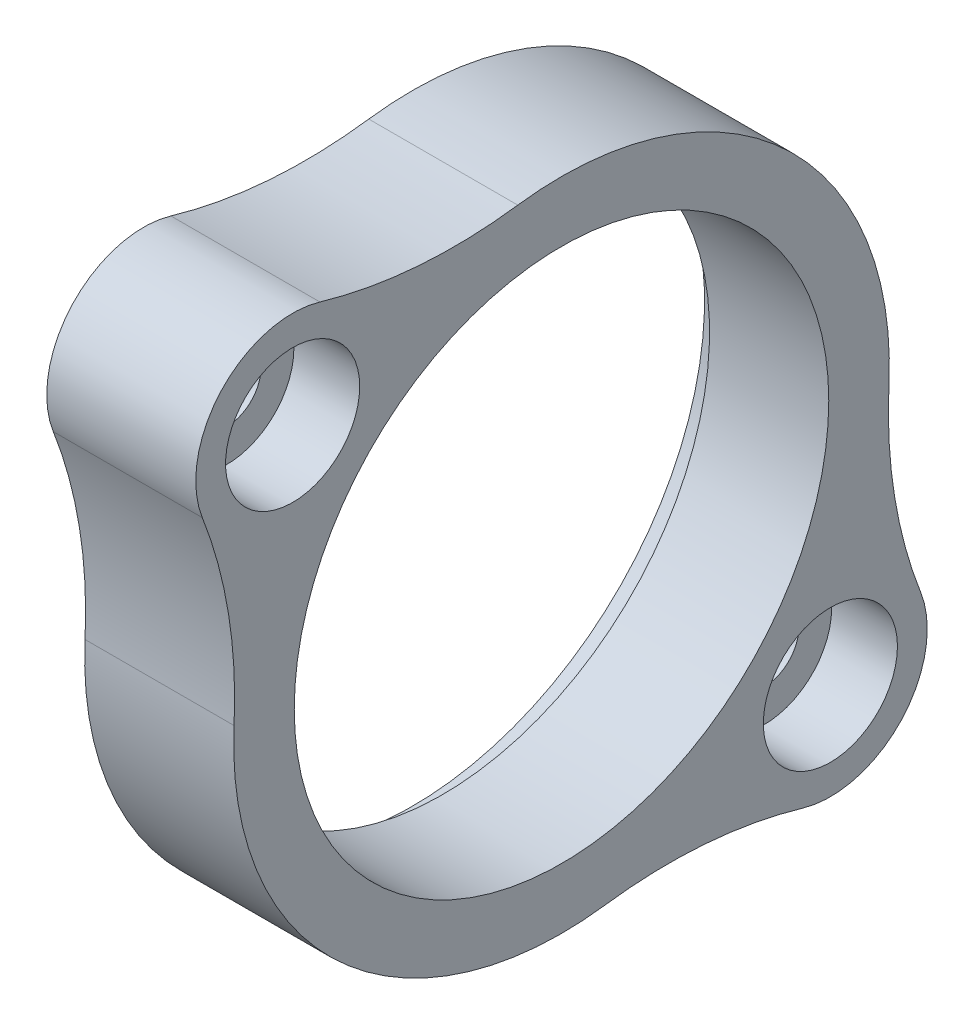
ISO-10303-21;
HEADER;
FILE_DESCRIPTION(('STEP AP214'),'2;1');
FILE_NAME('part.step','',(''),(''),'','','');
FILE_SCHEMA(('AUTOMOTIVE_DESIGN { 1 0 10303 214 1 1 1 1 }'));
ENDSEC;
DATA;
#1=APPLICATION_CONTEXT('core data for automotive mechanical design processes');
#2=APPLICATION_PROTOCOL_DEFINITION('international standard','automotive_design',2000,#1);
#3=PRODUCT_CONTEXT('',#1,'mechanical');
#4=PRODUCT('Part','Part','',(#3));
#5=PRODUCT_RELATED_PRODUCT_CATEGORY('part','',(#4));
#6=PRODUCT_DEFINITION_FORMATION('','',#4);
#7=PRODUCT_DEFINITION_CONTEXT('part definition',#1,'design');
#8=PRODUCT_DEFINITION('design','',#6,#7);
#9=PRODUCT_DEFINITION_SHAPE('','',#8);
#10=(LENGTH_UNIT() NAMED_UNIT(*) SI_UNIT(.MILLI.,.METRE.));
#11=(NAMED_UNIT(*) PLANE_ANGLE_UNIT() SI_UNIT($,.RADIAN.));
#12=(NAMED_UNIT(*) SI_UNIT($,.STERADIAN.) SOLID_ANGLE_UNIT());
#13=UNCERTAINTY_MEASURE_WITH_UNIT(LENGTH_MEASURE(1.E-05),#10,'distance_accuracy_value','');
#14=(GEOMETRIC_REPRESENTATION_CONTEXT(3) GLOBAL_UNCERTAINTY_ASSIGNED_CONTEXT((#13)) GLOBAL_UNIT_ASSIGNED_CONTEXT((#10,
#11,#12)) REPRESENTATION_CONTEXT('',''));
#15=CARTESIAN_POINT('',(0.,0.,0.));
#16=DIRECTION('',(0.,0.,1.));
#17=DIRECTION('',(1.,0.,0.));
#18=AXIS2_PLACEMENT_3D('',#15,#16,#17);
#19=CARTESIAN_POINT('',(54.0385,40.64,-143.949968041871));
#20=DIRECTION('',(-1.,0.,0.));
#21=DIRECTION('',(0.,0.,1.));
#22=AXIS2_PLACEMENT_3D('',#19,#20,#21);
#23=CYLINDRICAL_SURFACE('',#22,14.2367);
#24=CARTESIAN_POINT('',(54.0385,40.64,-143.949968041871));
#25=DIRECTION('',(1.,0.,0.));
#26=DIRECTION('',(0.,0.,-1.));
#27=AXIS2_PLACEMENT_3D('',#24,#25,#26);
#28=CIRCLE('',#27,14.2367);
#29=CARTESIAN_POINT('',(54.0385,40.64,-158.186668041871));
#30=VERTEX_POINT('',#29);
#31=EDGE_CURVE('E142',#30,#30,#28,.T.);
#32=ORIENTED_EDGE('',*,*,#31,.T.);
#33=EDGE_LOOP('',(#32));
#34=FACE_BOUND('',#33,.T.);
#35=CARTESIAN_POINT('',(47.6885,40.64,-143.949968041871));
#36=DIRECTION('',(-1.,0.,0.));
#37=DIRECTION('',(0.,0.,1.));
#38=AXIS2_PLACEMENT_3D('',#35,#36,#37);
#39=CIRCLE('',#38,14.2367);
#40=CARTESIAN_POINT('',(47.6885,40.64,-129.713268041871));
#41=VERTEX_POINT('',#40);
#42=EDGE_CURVE('E57',#41,#41,#39,.T.);
#43=ORIENTED_EDGE('',*,*,#42,.T.);
#44=EDGE_LOOP('',(#43));
#45=FACE_BOUND('',#44,.T.);
#46=ADVANCED_FACE('F53',(#34,#45),#23,.F.);
#47=CARTESIAN_POINT('',(54.0385,40.64,-143.949968041871));
#48=DIRECTION('',(-1.,0.,0.));
#49=DIRECTION('',(0.,0.,1.));
#50=AXIS2_PLACEMENT_3D('',#47,#48,#49);
#51=CYLINDRICAL_SURFACE('',#50,17.4625);
#52=CARTESIAN_POINT('',(54.0385,40.64,-143.949968041871));
#53=DIRECTION('',(1.,0.,0.));
#54=DIRECTION('',(0.,0.,-1.));
#55=AXIS2_PLACEMENT_3D('',#52,#53,#54);
#56=CIRCLE('',#55,17.4625);
#57=CARTESIAN_POINT('',(54.0385,41.4945079635615,-126.50838776971));
#58=VERTEX_POINT('',#57);
#59=CARTESIAN_POINT('',(54.0385,23.3335334287322,-146.279156971003));
#60=VERTEX_POINT('',#59);
#61=EDGE_CURVE('E132',#58,#60,#56,.T.);
#62=ORIENTED_EDGE('',*,*,#61,.F.);
#63=DIRECTION('',(-1.,0.,0.));
#64=VECTOR('',#63,1.);
#65=CARTESIAN_POINT('',(54.0385,41.4945079635615,-126.50838776971));
#66=LINE('',#65,#64);
#67=CARTESIAN_POINT('',(46.101,41.4945079635615,-126.50838776971));
#68=VERTEX_POINT('',#67);
#69=EDGE_CURVE('E200',#58,#68,#66,.T.);
#70=ORIENTED_EDGE('',*,*,#69,.T.);
#71=CARTESIAN_POINT('',(46.101,40.64,-143.949968041871));
#72=DIRECTION('',(1.,0.,0.));
#73=DIRECTION('',(0.,0.,-1.));
#74=AXIS2_PLACEMENT_3D('',#71,#72,#73);
#75=CIRCLE('',#74,17.4625);
#76=CARTESIAN_POINT('',(46.101,23.3335334287322,-146.279156971003));
#77=VERTEX_POINT('',#76);
#78=EDGE_CURVE('E194',#68,#77,#75,.T.);
#79=ORIENTED_EDGE('',*,*,#78,.T.);
#80=DIRECTION('',(-1.,0.,0.));
#81=VECTOR('',#80,1.);
#82=CARTESIAN_POINT('',(54.0385,23.3335334287322,-146.279156971003));
#83=LINE('',#82,#81);
#84=EDGE_CURVE('E197',#77,#60,#83,.F.);
#85=ORIENTED_EDGE('',*,*,#84,.T.);
#86=EDGE_LOOP('',(#62,#70,#79,#85));
#87=FACE_BOUND('',#86,.T.);
#88=ADVANCED_FACE('F216',(#87),#51,.T.);
#89=CARTESIAN_POINT('',(54.0385,40.64,-143.949968041871));
#90=DIRECTION('',(1.,0.,0.));
#91=DIRECTION('',(0.,0.,-1.));
#92=AXIS2_PLACEMENT_3D('',#89,#90,#91);
#93=PLANE('',#92);
#94=CARTESIAN_POINT('',(54.0385,53.7960220602239,-129.627791924011));
#95=DIRECTION('',(1.,0.,0.));
#96=DIRECTION('',(0.,0.,-1.));
#97=AXIS2_PLACEMENT_3D('',#94,#95,#96);
#98=CIRCLE('',#97,3.57250999999999);
#99=CARTESIAN_POINT('',(54.0385,53.7960220602239,-133.200301924011));
#100=VERTEX_POINT('',#99);
#101=EDGE_CURVE('E176',#100,#100,#98,.T.);
#102=ORIENTED_EDGE('',*,*,#101,.F.);
#103=EDGE_LOOP('',(#102));
#104=FACE_BOUND('',#103,.T.);
#105=CARTESIAN_POINT('',(54.0385,27.4839779397761,-158.272144159731));
#106=DIRECTION('',(1.,0.,0.));
#107=DIRECTION('',(0.,0.,-1.));
#108=AXIS2_PLACEMENT_3D('',#105,#106,#107);
#109=CIRCLE('',#108,3.57250999999999);
#110=CARTESIAN_POINT('',(54.0385,27.4839779397761,-161.844654159731));
#111=VERTEX_POINT('',#110);
#112=EDGE_CURVE('E163',#111,#111,#109,.T.);
#113=ORIENTED_EDGE('',*,*,#112,.F.);
#114=EDGE_LOOP('',(#113));
#115=FACE_BOUND('',#114,.T.);
#116=CARTESIAN_POINT('',(54.0385,53.7960220602239,-129.627791924011));
#117=DIRECTION('',(1.,0.,0.));
#118=DIRECTION('',(0.,0.,-1.));
#119=AXIS2_PLACEMENT_3D('',#116,#117,#118);
#120=CIRCLE('',#119,5.16000999999995);
#121=CARTESIAN_POINT('',(54.0385,58.7472470468954,-131.080745581723));
#122=VERTEX_POINT('',#121);
#123=CARTESIAN_POINT('',(54.0385,51.928795817645,-124.817472874392));
#124=VERTEX_POINT('',#123);
#125=EDGE_CURVE('E128',#122,#124,#120,.T.);
#126=ORIENTED_EDGE('',*,*,#125,.T.);
#127=CARTESIAN_POINT('',(54.0385,42.7374286378328,-101.13881646475));
#128=DIRECTION('',(1.,0.,0.));
#129=DIRECTION('',(0.,0.,-1.));
#130=AXIS2_PLACEMENT_3D('',#127,#128,#129);
#131=CIRCLE('',#130,25.4);
#132=EDGE_CURVE('E209',#124,#58,#131,.F.);
#133=ORIENTED_EDGE('',*,*,#132,.T.);
#134=ORIENTED_EDGE('',*,*,#61,.T.);
#135=CARTESIAN_POINT('',(54.0385,-1.83950885674813,-149.66706814065));
#136=DIRECTION('',(1.,0.,0.));
#137=DIRECTION('',(0.,0.,-1.));
#138=AXIS2_PLACEMENT_3D('',#135,#136,#137);
#139=CIRCLE('',#138,25.4);
#140=CARTESIAN_POINT('',(54.0385,22.5327529531045,-156.819190502019));
#141=VERTEX_POINT('',#140);
#142=EDGE_CURVE('E77',#60,#141,#139,.F.);
#143=ORIENTED_EDGE('',*,*,#142,.T.);
#144=CARTESIAN_POINT('',(54.0385,27.4839779397761,-158.272144159731));
#145=DIRECTION('',(1.,0.,0.));
#146=DIRECTION('',(0.,0.,-1.));
#147=AXIS2_PLACEMENT_3D('',#144,#145,#146);
#148=CIRCLE('',#147,5.16000999999998);
#149=CARTESIAN_POINT('',(54.0385,29.3512041823549,-163.08246320935));
#150=VERTEX_POINT('',#149);
#151=EDGE_CURVE('E159',#141,#150,#148,.T.);
#152=ORIENTED_EDGE('',*,*,#151,.T.);
#153=CARTESIAN_POINT('',(54.0385,38.5425713621671,-186.761119618991));
#154=DIRECTION('',(1.,0.,0.));
#155=DIRECTION('',(0.,0.,-1.));
#156=AXIS2_PLACEMENT_3D('',#153,#154,#155);
#157=CIRCLE('',#156,25.4);
#158=CARTESIAN_POINT('',(54.0385,39.7854920364385,-161.391548314031));
#159=VERTEX_POINT('',#158);
#160=EDGE_CURVE('E12',#150,#159,#157,.F.);
#161=ORIENTED_EDGE('',*,*,#160,.T.);
#162=CARTESIAN_POINT('',(54.0385,57.9464665712677,-141.620779112739));
#163=VERTEX_POINT('',#162);
#164=EDGE_CURVE('E191',#159,#163,#56,.T.);
#165=ORIENTED_EDGE('',*,*,#164,.T.);
#166=CARTESIAN_POINT('',(54.0385,83.1195088567481,-138.232867943092));
#167=DIRECTION('',(1.,0.,0.));
#168=DIRECTION('',(0.,0.,-1.));
#169=AXIS2_PLACEMENT_3D('',#166,#167,#168);
#170=CIRCLE('',#169,25.4);
#171=EDGE_CURVE('E148',#163,#122,#170,.F.);
#172=ORIENTED_EDGE('',*,*,#171,.T.);
#173=EDGE_LOOP('',(#126,#133,#134,#143,#152,#161,#165,#172));
#174=FACE_BOUND('',#173,.T.);
#175=ORIENTED_EDGE('',*,*,#31,.F.);
#176=EDGE_LOOP('',(#175));
#177=FACE_BOUND('',#176,.T.);
#178=ADVANCED_FACE('F211',(#104,#115,#174,#177),#93,.T.);
#179=CARTESIAN_POINT('',(46.101,40.64,-143.949968041871));
#180=DIRECTION('',(1.,0.,0.));
#181=DIRECTION('',(0.,0.,-1.));
#182=AXIS2_PLACEMENT_3D('',#179,#180,#181);
#183=PLANE('',#182);
#184=CARTESIAN_POINT('',(46.101,40.64,-143.949968041871));
#185=DIRECTION('',(-1.,0.,0.));
#186=DIRECTION('',(0.,0.,1.));
#187=AXIS2_PLACEMENT_3D('',#184,#185,#186);
#188=CIRCLE('',#187,15.5575);
#189=CARTESIAN_POINT('',(46.101,40.64,-128.392468041871));
#190=VERTEX_POINT('',#189);
#191=EDGE_CURVE('E307',#190,#190,#188,.T.);
#192=ORIENTED_EDGE('',*,*,#191,.F.);
#193=EDGE_LOOP('',(#192));
#194=FACE_BOUND('',#193,.T.);
#195=CARTESIAN_POINT('',(46.101,53.7960220602239,-129.627791924011));
#196=DIRECTION('',(1.,0.,0.));
#197=DIRECTION('',(0.,0.,-1.));
#198=AXIS2_PLACEMENT_3D('',#195,#196,#197);
#199=CIRCLE('',#198,1.8288);
#200=CARTESIAN_POINT('',(46.101,53.7960220602239,-131.456591924011));
#201=VERTEX_POINT('',#200);
#202=EDGE_CURVE('E161',#201,#201,#199,.T.);
#203=ORIENTED_EDGE('',*,*,#202,.T.);
#204=EDGE_LOOP('',(#203));
#205=FACE_BOUND('',#204,.T.);
#206=CARTESIAN_POINT('',(46.101,27.4839779397761,-158.272144159731));
#207=DIRECTION('',(1.,0.,0.));
#208=DIRECTION('',(0.,0.,-1.));
#209=AXIS2_PLACEMENT_3D('',#206,#207,#208);
#210=CIRCLE('',#209,1.8288);
#211=CARTESIAN_POINT('',(46.101,27.4839779397761,-160.100944159731));
#212=VERTEX_POINT('',#211);
#213=EDGE_CURVE('E157',#212,#212,#210,.T.);
#214=ORIENTED_EDGE('',*,*,#213,.T.);
#215=EDGE_LOOP('',(#214));
#216=FACE_BOUND('',#215,.T.);
#217=CARTESIAN_POINT('',(46.101,39.7854920364385,-161.391548314031));
#218=VERTEX_POINT('',#217);
#219=CARTESIAN_POINT('',(46.101,57.9464665712677,-141.620779112739));
#220=VERTEX_POINT('',#219);
#221=EDGE_CURVE('E190',#218,#220,#75,.T.);
#222=ORIENTED_EDGE('',*,*,#221,.F.);
#223=CARTESIAN_POINT('',(46.101,38.5425713621671,-186.761119618991));
#224=DIRECTION('',(1.,0.,0.));
#225=DIRECTION('',(0.,0.,-1.));
#226=AXIS2_PLACEMENT_3D('',#223,#224,#225);
#227=CIRCLE('',#226,25.4);
#228=CARTESIAN_POINT('',(46.101,29.3512041823549,-163.08246320935));
#229=VERTEX_POINT('',#228);
#230=EDGE_CURVE('E62',#218,#229,#227,.T.);
#231=ORIENTED_EDGE('',*,*,#230,.T.);
#232=CARTESIAN_POINT('',(46.101,27.4839779397761,-158.272144159731));
#233=DIRECTION('',(-1.,0.,0.));
#234=DIRECTION('',(0.,0.,1.));
#235=AXIS2_PLACEMENT_3D('',#232,#233,#234);
#236=CIRCLE('',#235,5.16000999999998);
#237=CARTESIAN_POINT('',(46.101,22.5327529531045,-156.819190502019));
#238=VERTEX_POINT('',#237);
#239=EDGE_CURVE('E185',#238,#229,#236,.F.);
#240=ORIENTED_EDGE('',*,*,#239,.F.);
#241=CARTESIAN_POINT('',(46.101,-1.83950885674813,-149.66706814065));
#242=DIRECTION('',(1.,0.,0.));
#243=DIRECTION('',(0.,0.,-1.));
#244=AXIS2_PLACEMENT_3D('',#241,#242,#243);
#245=CIRCLE('',#244,25.4);
#246=EDGE_CURVE('E150',#238,#77,#245,.T.);
#247=ORIENTED_EDGE('',*,*,#246,.T.);
#248=ORIENTED_EDGE('',*,*,#78,.F.);
#249=CARTESIAN_POINT('',(46.101,42.7374286378328,-101.13881646475));
#250=DIRECTION('',(1.,0.,0.));
#251=DIRECTION('',(0.,0.,-1.));
#252=AXIS2_PLACEMENT_3D('',#249,#250,#251);
#253=CIRCLE('',#252,25.4);
#254=CARTESIAN_POINT('',(46.101,51.928795817645,-124.817472874392));
#255=VERTEX_POINT('',#254);
#256=EDGE_CURVE('E141',#68,#255,#253,.T.);
#257=ORIENTED_EDGE('',*,*,#256,.T.);
#258=CARTESIAN_POINT('',(46.101,53.7960220602239,-129.627791924011));
#259=DIRECTION('',(-1.,0.,0.));
#260=DIRECTION('',(0.,0.,1.));
#261=AXIS2_PLACEMENT_3D('',#258,#259,#260);
#262=CIRCLE('',#261,5.16000999999995);
#263=CARTESIAN_POINT('',(46.101,58.7472470468954,-131.080745581723));
#264=VERTEX_POINT('',#263);
#265=EDGE_CURVE('E125',#264,#255,#262,.F.);
#266=ORIENTED_EDGE('',*,*,#265,.F.);
#267=CARTESIAN_POINT('',(46.101,83.1195088567481,-138.232867943092));
#268=DIRECTION('',(1.,0.,0.));
#269=DIRECTION('',(0.,0.,-1.));
#270=AXIS2_PLACEMENT_3D('',#267,#268,#269);
#271=CIRCLE('',#270,25.4);
#272=EDGE_CURVE('E137',#264,#220,#271,.T.);
#273=ORIENTED_EDGE('',*,*,#272,.T.);
#274=EDGE_LOOP('',(#222,#231,#240,#247,#248,#257,#266,#273));
#275=FACE_BOUND('',#274,.T.);
#276=ADVANCED_FACE('F136',(#194,#205,#216,#275),#183,.F.);
#277=ORIENTED_EDGE('',*,*,#221,.T.);
#278=DIRECTION('',(-1.,0.,0.));
#279=VECTOR('',#278,1.);
#280=CARTESIAN_POINT('',(54.0385,57.9464665712677,-141.620779112739));
#281=LINE('',#280,#279);
#282=EDGE_CURVE('E147',#220,#163,#281,.F.);
#283=ORIENTED_EDGE('',*,*,#282,.T.);
#284=ORIENTED_EDGE('',*,*,#164,.F.);
#285=DIRECTION('',(-1.,0.,0.));
#286=VECTOR('',#285,1.);
#287=CARTESIAN_POINT('',(54.0385,39.7854920364385,-161.391548314031));
#288=LINE('',#287,#286);
#289=EDGE_CURVE('E202',#159,#218,#288,.T.);
#290=ORIENTED_EDGE('',*,*,#289,.T.);
#291=EDGE_LOOP('',(#277,#283,#284,#290));
#292=FACE_BOUND('',#291,.T.);
#293=ADVANCED_FACE('F237',(#292),#51,.T.);
#294=CARTESIAN_POINT('',(31.5062877520384,53.7960220602239,-129.627791924011));
#295=DIRECTION('',(1.,0.,0.));
#296=DIRECTION('',(0.,0.,-1.));
#297=AXIS2_PLACEMENT_3D('',#294,#295,#296);
#298=CYLINDRICAL_SURFACE('',#297,5.16000999999995);
#299=ORIENTED_EDGE('',*,*,#265,.T.);
#300=DIRECTION('',(1.,0.,0.));
#301=VECTOR('',#300,1.);
#302=CARTESIAN_POINT('',(31.5062877520384,51.928795817645,-124.817472874392));
#303=LINE('',#302,#301);
#304=EDGE_CURVE('E131',#255,#124,#303,.T.);
#305=ORIENTED_EDGE('',*,*,#304,.T.);
#306=ORIENTED_EDGE('',*,*,#125,.F.);
#307=DIRECTION('',(1.,0.,0.));
#308=VECTOR('',#307,1.);
#309=CARTESIAN_POINT('',(31.5062877520384,58.7472470468954,-131.080745581723));
#310=LINE('',#309,#308);
#311=EDGE_CURVE('E121',#122,#264,#310,.F.);
#312=ORIENTED_EDGE('',*,*,#311,.T.);
#313=EDGE_LOOP('',(#299,#305,#306,#312));
#314=FACE_BOUND('',#313,.T.);
#315=ADVANCED_FACE('F123',(#314),#298,.T.);
#316=CARTESIAN_POINT('',(31.5062877520384,27.4839779397761,-158.272144159731));
#317=DIRECTION('',(1.,0.,0.));
#318=DIRECTION('',(0.,0.,-1.));
#319=AXIS2_PLACEMENT_3D('',#316,#317,#318);
#320=CYLINDRICAL_SURFACE('',#319,5.16000999999998);
#321=ORIENTED_EDGE('',*,*,#151,.F.);
#322=DIRECTION('',(1.,0.,0.));
#323=VECTOR('',#322,1.);
#324=CARTESIAN_POINT('',(31.5062877520384,22.5327529531045,-156.819190502019));
#325=LINE('',#324,#323);
#326=EDGE_CURVE('E207',#141,#238,#325,.F.);
#327=ORIENTED_EDGE('',*,*,#326,.T.);
#328=ORIENTED_EDGE('',*,*,#239,.T.);
#329=DIRECTION('',(1.,0.,0.));
#330=VECTOR('',#329,1.);
#331=CARTESIAN_POINT('',(31.5062877520384,29.3512041823549,-163.08246320935));
#332=LINE('',#331,#330);
#333=EDGE_CURVE('E70',#229,#150,#332,.T.);
#334=ORIENTED_EDGE('',*,*,#333,.T.);
#335=EDGE_LOOP('',(#321,#327,#328,#334));
#336=FACE_BOUND('',#335,.T.);
#337=ADVANCED_FACE('F221',(#336),#320,.T.);
#338=CARTESIAN_POINT('',(54.0385,42.7374286378328,-101.13881646475));
#339=DIRECTION('',(-1.,0.,0.));
#340=DIRECTION('',(0.,0.,1.));
#341=AXIS2_PLACEMENT_3D('',#338,#339,#340);
#342=CYLINDRICAL_SURFACE('',#341,25.4);
#343=ORIENTED_EDGE('',*,*,#256,.F.);
#344=ORIENTED_EDGE('',*,*,#69,.F.);
#345=ORIENTED_EDGE('',*,*,#132,.F.);
#346=ORIENTED_EDGE('',*,*,#304,.F.);
#347=EDGE_LOOP('',(#343,#344,#345,#346));
#348=FACE_BOUND('',#347,.T.);
#349=ADVANCED_FACE('F219',(#348),#342,.F.);
#350=CARTESIAN_POINT('',(31.5062877520384,83.1195088567481,-138.232867943092));
#351=DIRECTION('',(-1.,0.,0.));
#352=DIRECTION('',(0.,0.,1.));
#353=AXIS2_PLACEMENT_3D('',#350,#351,#352);
#354=CYLINDRICAL_SURFACE('',#353,25.4);
#355=ORIENTED_EDGE('',*,*,#272,.F.);
#356=ORIENTED_EDGE('',*,*,#311,.F.);
#357=ORIENTED_EDGE('',*,*,#171,.F.);
#358=ORIENTED_EDGE('',*,*,#282,.F.);
#359=EDGE_LOOP('',(#355,#356,#357,#358));
#360=FACE_BOUND('',#359,.T.);
#361=ADVANCED_FACE('F145',(#360),#354,.F.);
#362=CARTESIAN_POINT('',(31.5062877520384,-1.83950885674813,-149.66706814065));
#363=DIRECTION('',(-1.,0.,0.));
#364=DIRECTION('',(0.,0.,1.));
#365=AXIS2_PLACEMENT_3D('',#362,#363,#364);
#366=CYLINDRICAL_SURFACE('',#365,25.4);
#367=ORIENTED_EDGE('',*,*,#246,.F.);
#368=ORIENTED_EDGE('',*,*,#326,.F.);
#369=ORIENTED_EDGE('',*,*,#142,.F.);
#370=ORIENTED_EDGE('',*,*,#84,.F.);
#371=EDGE_LOOP('',(#367,#368,#369,#370));
#372=FACE_BOUND('',#371,.T.);
#373=ADVANCED_FACE('F227',(#372),#366,.F.);
#374=CARTESIAN_POINT('',(31.5062877520384,38.5425713621671,-186.761119618991));
#375=DIRECTION('',(1.,0.,0.));
#376=DIRECTION('',(0.,0.,-1.));
#377=AXIS2_PLACEMENT_3D('',#374,#375,#376);
#378=CYLINDRICAL_SURFACE('',#377,25.4);
#379=ORIENTED_EDGE('',*,*,#160,.F.);
#380=ORIENTED_EDGE('',*,*,#333,.F.);
#381=ORIENTED_EDGE('',*,*,#230,.F.);
#382=ORIENTED_EDGE('',*,*,#289,.F.);
#383=EDGE_LOOP('',(#379,#380,#381,#382));
#384=FACE_BOUND('',#383,.T.);
#385=ADVANCED_FACE('F55',(#384),#378,.F.);
#386=CARTESIAN_POINT('',(54.0385,27.4839779397761,-158.272144159731));
#387=DIRECTION('',(1.,0.,0.));
#388=DIRECTION('',(0.,0.,-1.));
#389=AXIS2_PLACEMENT_3D('',#386,#387,#388);
#390=CYLINDRICAL_SURFACE('',#389,1.8288);
#391=CARTESIAN_POINT('',(50.5333,27.4839779397761,-158.272144159731));
#392=DIRECTION('',(1.,0.,0.));
#393=DIRECTION('',(0.,0.,-1.));
#394=AXIS2_PLACEMENT_3D('',#391,#392,#393);
#395=CIRCLE('',#394,1.8288);
#396=CARTESIAN_POINT('',(50.5333,27.4839779397761,-160.100944159731));
#397=VERTEX_POINT('',#396);
#398=EDGE_CURVE('E160',#397,#397,#395,.T.);
#399=ORIENTED_EDGE('',*,*,#398,.T.);
#400=EDGE_LOOP('',(#399));
#401=FACE_BOUND('',#400,.T.);
#402=ORIENTED_EDGE('',*,*,#213,.F.);
#403=EDGE_LOOP('',(#402));
#404=FACE_BOUND('',#403,.T.);
#405=ADVANCED_FACE('F263',(#401,#404),#390,.F.);
#406=CARTESIAN_POINT('',(50.5333,29.3127779397761,-158.272144159731));
#407=DIRECTION('',(-1.,0.,0.));
#408=DIRECTION('',(0.,0.,1.));
#409=AXIS2_PLACEMENT_3D('',#406,#407,#408);
#410=PLANE('',#409);
#411=ORIENTED_EDGE('',*,*,#398,.F.);
#412=EDGE_LOOP('',(#411));
#413=FACE_BOUND('',#412,.T.);
#414=CARTESIAN_POINT('',(50.5333,27.4839779397761,-158.272144159731));
#415=DIRECTION('',(1.,0.,0.));
#416=DIRECTION('',(0.,0.,-1.));
#417=AXIS2_PLACEMENT_3D('',#414,#415,#416);
#418=CIRCLE('',#417,3.57250999999999);
#419=CARTESIAN_POINT('',(50.5333,27.4839779397761,-161.844654159731));
#420=VERTEX_POINT('',#419);
#421=EDGE_CURVE('E168',#420,#420,#418,.T.);
#422=ORIENTED_EDGE('',*,*,#421,.T.);
#423=EDGE_LOOP('',(#422));
#424=FACE_BOUND('',#423,.T.);
#425=ADVANCED_FACE('F267',(#413,#424),#410,.F.);
#426=CARTESIAN_POINT('',(54.0385,27.4839779397761,-158.272144159731));
#427=DIRECTION('',(1.,0.,0.));
#428=DIRECTION('',(0.,0.,-1.));
#429=AXIS2_PLACEMENT_3D('',#426,#427,#428);
#430=CYLINDRICAL_SURFACE('',#429,3.57250999999999);
#431=ORIENTED_EDGE('',*,*,#421,.F.);
#432=EDGE_LOOP('',(#431));
#433=FACE_BOUND('',#432,.T.);
#434=ORIENTED_EDGE('',*,*,#112,.T.);
#435=EDGE_LOOP('',(#434));
#436=FACE_BOUND('',#435,.T.);
#437=ADVANCED_FACE('F273',(#433,#436),#430,.F.);
#438=CARTESIAN_POINT('',(54.0385,53.7960220602239,-129.627791924011));
#439=DIRECTION('',(1.,0.,0.));
#440=DIRECTION('',(0.,0.,-1.));
#441=AXIS2_PLACEMENT_3D('',#438,#439,#440);
#442=CYLINDRICAL_SURFACE('',#441,1.8288);
#443=CARTESIAN_POINT('',(50.5333,53.7960220602239,-129.627791924011));
#444=DIRECTION('',(1.,0.,0.));
#445=DIRECTION('',(0.,0.,-1.));
#446=AXIS2_PLACEMENT_3D('',#443,#444,#445);
#447=CIRCLE('',#446,1.8288);
#448=CARTESIAN_POINT('',(50.5333,53.7960220602239,-131.456591924011));
#449=VERTEX_POINT('',#448);
#450=EDGE_CURVE('E164',#449,#449,#447,.T.);
#451=ORIENTED_EDGE('',*,*,#450,.T.);
#452=EDGE_LOOP('',(#451));
#453=FACE_BOUND('',#452,.T.);
#454=ORIENTED_EDGE('',*,*,#202,.F.);
#455=EDGE_LOOP('',(#454));
#456=FACE_BOUND('',#455,.T.);
#457=ADVANCED_FACE('F280',(#453,#456),#442,.F.);
#458=CARTESIAN_POINT('',(50.5333,55.6248220602239,-129.627791924011));
#459=DIRECTION('',(-1.,0.,0.));
#460=DIRECTION('',(0.,0.,1.));
#461=AXIS2_PLACEMENT_3D('',#458,#459,#460);
#462=PLANE('',#461);
#463=ORIENTED_EDGE('',*,*,#450,.F.);
#464=EDGE_LOOP('',(#463));
#465=FACE_BOUND('',#464,.T.);
#466=CARTESIAN_POINT('',(50.5333,53.7960220602239,-129.627791924011));
#467=DIRECTION('',(1.,0.,0.));
#468=DIRECTION('',(0.,0.,-1.));
#469=AXIS2_PLACEMENT_3D('',#466,#467,#468);
#470=CIRCLE('',#469,3.57250999999999);
#471=CARTESIAN_POINT('',(50.5333,53.7960220602239,-133.200301924011));
#472=VERTEX_POINT('',#471);
#473=EDGE_CURVE('E171',#472,#472,#470,.T.);
#474=ORIENTED_EDGE('',*,*,#473,.T.);
#475=EDGE_LOOP('',(#474));
#476=FACE_BOUND('',#475,.T.);
#477=ADVANCED_FACE('F284',(#465,#476),#462,.F.);
#478=CARTESIAN_POINT('',(54.0385,53.7960220602239,-129.627791924011));
#479=DIRECTION('',(1.,0.,0.));
#480=DIRECTION('',(0.,0.,-1.));
#481=AXIS2_PLACEMENT_3D('',#478,#479,#480);
#482=CYLINDRICAL_SURFACE('',#481,3.57250999999999);
#483=ORIENTED_EDGE('',*,*,#473,.F.);
#484=EDGE_LOOP('',(#483));
#485=FACE_BOUND('',#484,.T.);
#486=ORIENTED_EDGE('',*,*,#101,.T.);
#487=EDGE_LOOP('',(#486));
#488=FACE_BOUND('',#487,.T.);
#489=ADVANCED_FACE('F287',(#485,#488),#482,.F.);
#490=CARTESIAN_POINT('',(47.6885,40.64,-143.949968041871));
#491=DIRECTION('',(-1.,0.,0.));
#492=DIRECTION('',(0.,0.,1.));
#493=AXIS2_PLACEMENT_3D('',#490,#491,#492);
#494=CYLINDRICAL_SURFACE('',#493,15.5575);
#495=CARTESIAN_POINT('',(47.6885,40.64,-143.949968041871));
#496=DIRECTION('',(-1.,0.,0.));
#497=DIRECTION('',(0.,0.,1.));
#498=AXIS2_PLACEMENT_3D('',#495,#496,#497);
#499=CIRCLE('',#498,15.5575);
#500=CARTESIAN_POINT('',(47.6885,40.64,-128.392468041871));
#501=VERTEX_POINT('',#500);
#502=EDGE_CURVE('E306',#501,#501,#499,.T.);
#503=ORIENTED_EDGE('',*,*,#502,.F.);
#504=EDGE_LOOP('',(#503));
#505=FACE_BOUND('',#504,.T.);
#506=ORIENTED_EDGE('',*,*,#191,.T.);
#507=EDGE_LOOP('',(#506));
#508=FACE_BOUND('',#507,.T.);
#509=ADVANCED_FACE('F291',(#505,#508),#494,.F.);
#510=CARTESIAN_POINT('',(47.6885,40.64,-143.949968041871));
#511=DIRECTION('',(-1.,0.,0.));
#512=DIRECTION('',(0.,0.,1.));
#513=AXIS2_PLACEMENT_3D('',#510,#511,#512);
#514=PLANE('',#513);
#515=ORIENTED_EDGE('',*,*,#42,.F.);
#516=EDGE_LOOP('',(#515));
#517=FACE_BOUND('',#516,.T.);
#518=ORIENTED_EDGE('',*,*,#502,.T.);
#519=EDGE_LOOP('',(#518));
#520=FACE_BOUND('',#519,.T.);
#521=ADVANCED_FACE('F295',(#517,#520),#514,.T.);
#522=CLOSED_SHELL('',(#46,#88,#178,#276,#293,#315,#337,#349,#361,#373,#385,#405,#425,#437,#457,
#477,#489,#509,#521));
#523=MANIFOLD_SOLID_BREP('B2',#522);
#524=ADVANCED_BREP_SHAPE_REPRESENTATION('',(#18,#523),#14);
#525=SHAPE_DEFINITION_REPRESENTATION(#9,#524);
ENDSEC;
END-ISO-10303-21;
